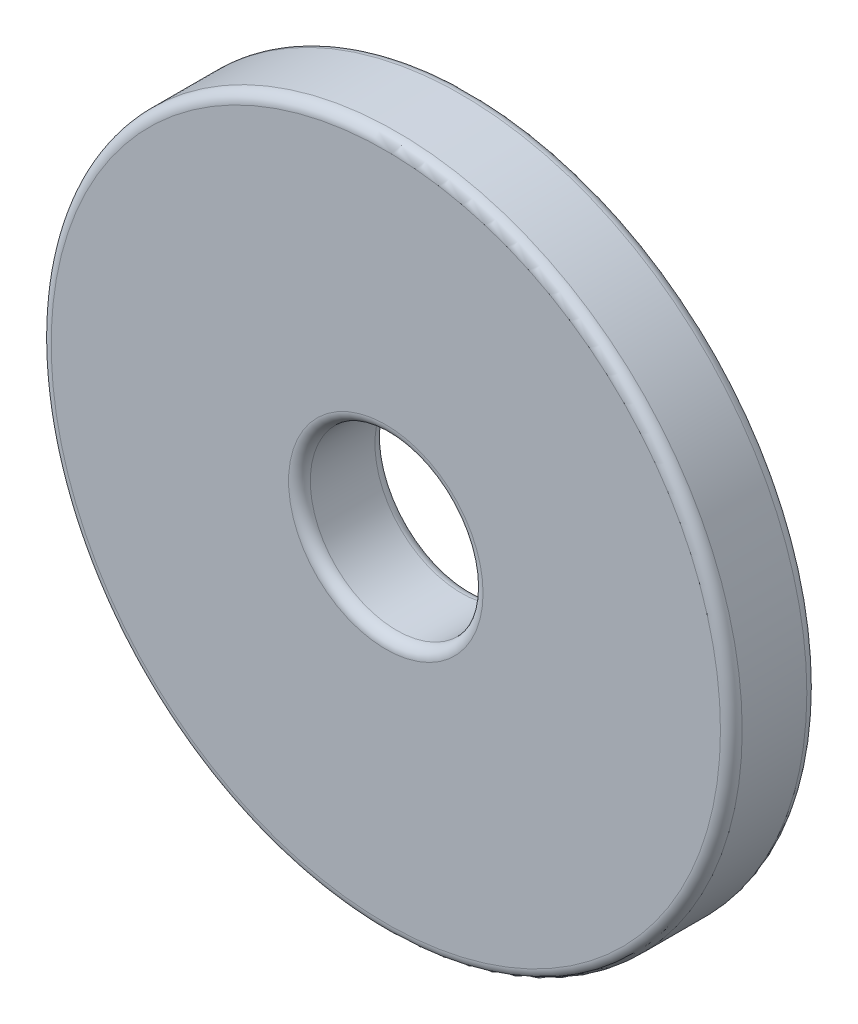
ISO-10303-21;
HEADER;
FILE_DESCRIPTION(('STEP AP214'),'2;1');
FILE_NAME('part.step','',(''),(''),'','','');
FILE_SCHEMA(('AUTOMOTIVE_DESIGN { 1 0 10303 214 1 1 1 1 }'));
ENDSEC;
DATA;
#1=APPLICATION_CONTEXT('core data for automotive mechanical design processes');
#2=APPLICATION_PROTOCOL_DEFINITION('international standard','automotive_design',2000,#1);
#3=PRODUCT_CONTEXT('',#1,'mechanical');
#4=PRODUCT('Part','Part','',(#3));
#5=PRODUCT_RELATED_PRODUCT_CATEGORY('part','',(#4));
#6=PRODUCT_DEFINITION_FORMATION('','',#4);
#7=PRODUCT_DEFINITION_CONTEXT('part definition',#1,'design');
#8=PRODUCT_DEFINITION('design','',#6,#7);
#9=PRODUCT_DEFINITION_SHAPE('','',#8);
#10=(LENGTH_UNIT() NAMED_UNIT(*) SI_UNIT(.MILLI.,.METRE.));
#11=(NAMED_UNIT(*) PLANE_ANGLE_UNIT() SI_UNIT($,.RADIAN.));
#12=(NAMED_UNIT(*) SI_UNIT($,.STERADIAN.) SOLID_ANGLE_UNIT());
#13=UNCERTAINTY_MEASURE_WITH_UNIT(LENGTH_MEASURE(1.E-05),#10,'distance_accuracy_value','');
#14=(GEOMETRIC_REPRESENTATION_CONTEXT(3) GLOBAL_UNCERTAINTY_ASSIGNED_CONTEXT((#13)) GLOBAL_UNIT_ASSIGNED_CONTEXT((#10,
#11,#12)) REPRESENTATION_CONTEXT('',''));
#15=CARTESIAN_POINT('',(0.,0.,0.));
#16=DIRECTION('',(0.,0.,1.));
#17=DIRECTION('',(1.,0.,0.));
#18=AXIS2_PLACEMENT_3D('',#15,#16,#17);
#19=CARTESIAN_POINT('',(68.3982464909084,3.21438697688714,1.5875));
#20=DIRECTION('',(0.,0.,-1.));
#21=DIRECTION('',(-1.,0.,0.));
#22=AXIS2_PLACEMENT_3D('',#19,#20,#21);
#23=CYLINDRICAL_SURFACE('',#22,6.35);
#24=CARTESIAN_POINT('',(68.3982464909084,3.21438697688714,0.2));
#25=DIRECTION('',(0.,0.,1.));
#26=DIRECTION('',(1.,0.,0.));
#27=AXIS2_PLACEMENT_3D('',#24,#25,#26);
#28=CIRCLE('',#27,6.35);
#29=CARTESIAN_POINT('',(74.7482464909084,3.21438697688714,0.2));
#30=VERTEX_POINT('',#29);
#31=EDGE_CURVE('E68',#30,#30,#28,.T.);
#32=ORIENTED_EDGE('',*,*,#31,.T.);
#33=EDGE_LOOP('',(#32));
#34=FACE_BOUND('',#33,.T.);
#35=CARTESIAN_POINT('',(68.3982464909084,3.21438697688714,1.3875));
#36=DIRECTION('',(0.,0.,1.));
#37=DIRECTION('',(1.,0.,0.));
#38=AXIS2_PLACEMENT_3D('',#35,#36,#37);
#39=CIRCLE('',#38,6.35);
#40=CARTESIAN_POINT('',(74.7482464909084,3.21438697688714,1.3875));
#41=VERTEX_POINT('',#40);
#42=EDGE_CURVE('E72',#41,#41,#39,.F.);
#43=ORIENTED_EDGE('',*,*,#42,.T.);
#44=EDGE_LOOP('',(#43));
#45=FACE_BOUND('',#44,.T.);
#46=ADVANCED_FACE('F36',(#34,#45),#23,.T.);
#47=CARTESIAN_POINT('',(68.3982464909084,3.21438697688714,1.5875));
#48=DIRECTION('',(0.,0.,1.));
#49=DIRECTION('',(1.,0.,0.));
#50=AXIS2_PLACEMENT_3D('',#47,#48,#49);
#51=PLANE('',#50);
#52=CARTESIAN_POINT('',(68.3982464909084,3.21438697688714,1.5875));
#53=DIRECTION('',(0.,0.,1.));
#54=DIRECTION('',(1.,0.,0.));
#55=AXIS2_PLACEMENT_3D('',#52,#53,#54);
#56=CIRCLE('',#55,6.15);
#57=CARTESIAN_POINT('',(74.5482464909084,3.21438697688714,1.5875));
#58=VERTEX_POINT('',#57);
#59=EDGE_CURVE('E10',#58,#58,#56,.T.);
#60=ORIENTED_EDGE('',*,*,#59,.T.);
#61=EDGE_LOOP('',(#60));
#62=FACE_BOUND('',#61,.T.);
#63=CARTESIAN_POINT('',(68.3982464909084,3.21438697688714,1.5875));
#64=DIRECTION('',(0.,0.,1.));
#65=DIRECTION('',(1.,0.,0.));
#66=AXIS2_PLACEMENT_3D('',#63,#64,#65);
#67=CIRCLE('',#66,1.7875);
#68=CARTESIAN_POINT('',(70.1857464909084,3.21438697688714,1.5875));
#69=VERTEX_POINT('',#68);
#70=EDGE_CURVE('E44',#69,#69,#67,.F.);
#71=ORIENTED_EDGE('',*,*,#70,.T.);
#72=EDGE_LOOP('',(#71));
#73=FACE_BOUND('',#72,.T.);
#74=ADVANCED_FACE('F91',(#62,#73),#51,.T.);
#75=CARTESIAN_POINT('',(68.3982464909084,3.21438697688714,0.));
#76=DIRECTION('',(0.,0.,1.));
#77=DIRECTION('',(1.,0.,0.));
#78=AXIS2_PLACEMENT_3D('',#75,#76,#77);
#79=PLANE('',#78);
#80=CARTESIAN_POINT('',(68.3982464909084,3.21438697688714,0.));
#81=DIRECTION('',(0.,0.,1.));
#82=DIRECTION('',(1.,0.,0.));
#83=AXIS2_PLACEMENT_3D('',#80,#81,#82);
#84=CIRCLE('',#83,6.15);
#85=CARTESIAN_POINT('',(74.5482464909084,3.21438697688714,0.));
#86=VERTEX_POINT('',#85);
#87=EDGE_CURVE('E60',#86,#86,#84,.F.);
#88=ORIENTED_EDGE('',*,*,#87,.T.);
#89=EDGE_LOOP('',(#88));
#90=FACE_BOUND('',#89,.T.);
#91=CARTESIAN_POINT('',(68.3982464909084,3.21438697688714,0.));
#92=DIRECTION('',(0.,0.,1.));
#93=DIRECTION('',(1.,0.,0.));
#94=AXIS2_PLACEMENT_3D('',#91,#92,#93);
#95=CIRCLE('',#94,1.7875);
#96=CARTESIAN_POINT('',(70.1857464909084,3.21438697688714,0.));
#97=VERTEX_POINT('',#96);
#98=EDGE_CURVE('E64',#97,#97,#95,.T.);
#99=ORIENTED_EDGE('',*,*,#98,.T.);
#100=EDGE_LOOP('',(#99));
#101=FACE_BOUND('',#100,.T.);
#102=ADVANCED_FACE('F97',(#90,#101),#79,.F.);
#103=CARTESIAN_POINT('',(68.3982464909084,3.21438697688714,1.5875));
#104=DIRECTION('',(0.,0.,-1.));
#105=DIRECTION('',(-1.,0.,0.));
#106=AXIS2_PLACEMENT_3D('',#103,#104,#105);
#107=CYLINDRICAL_SURFACE('',#106,1.5875);
#108=CARTESIAN_POINT('',(68.3982464909084,3.21438697688714,0.2));
#109=DIRECTION('',(0.,0.,1.));
#110=DIRECTION('',(1.,0.,0.));
#111=AXIS2_PLACEMENT_3D('',#108,#109,#110);
#112=CIRCLE('',#111,1.5875);
#113=CARTESIAN_POINT('',(69.9857464909084,3.21438697688714,0.2));
#114=VERTEX_POINT('',#113);
#115=EDGE_CURVE('E49',#114,#114,#112,.F.);
#116=ORIENTED_EDGE('',*,*,#115,.T.);
#117=EDGE_LOOP('',(#116));
#118=FACE_BOUND('',#117,.T.);
#119=CARTESIAN_POINT('',(68.3982464909084,3.21438697688714,1.3875));
#120=DIRECTION('',(0.,0.,1.));
#121=DIRECTION('',(1.,0.,0.));
#122=AXIS2_PLACEMENT_3D('',#119,#120,#121);
#123=CIRCLE('',#122,1.5875);
#124=CARTESIAN_POINT('',(69.9857464909084,3.21438697688714,1.3875));
#125=VERTEX_POINT('',#124);
#126=EDGE_CURVE('E54',#125,#125,#123,.T.);
#127=ORIENTED_EDGE('',*,*,#126,.T.);
#128=EDGE_LOOP('',(#127));
#129=FACE_BOUND('',#128,.T.);
#130=ADVANCED_FACE('F102',(#118,#129),#107,.F.);
#131=CARTESIAN_POINT('',(68.3982464909084,3.21438697688714,0.2));
#132=DIRECTION('',(0.,0.,1.));
#133=DIRECTION('',(1.,0.,0.));
#134=AXIS2_PLACEMENT_3D('',#131,#132,#133);
#135=TOROIDAL_SURFACE('',#134,6.15,0.2);
#136=ORIENTED_EDGE('',*,*,#87,.F.);
#137=EDGE_LOOP('',(#136));
#138=FACE_BOUND('',#137,.T.);
#139=ORIENTED_EDGE('',*,*,#31,.F.);
#140=EDGE_LOOP('',(#139));
#141=FACE_BOUND('',#140,.T.);
#142=ADVANCED_FACE('F87',(#138,#141),#135,.T.);
#143=CARTESIAN_POINT('',(68.3982464909084,3.21438697688714,0.2));
#144=DIRECTION('',(0.,0.,1.));
#145=DIRECTION('',(1.,0.,0.));
#146=AXIS2_PLACEMENT_3D('',#143,#144,#145);
#147=TOROIDAL_SURFACE('',#146,1.7875,0.2);
#148=ORIENTED_EDGE('',*,*,#98,.F.);
#149=EDGE_LOOP('',(#148));
#150=FACE_BOUND('',#149,.T.);
#151=ORIENTED_EDGE('',*,*,#115,.F.);
#152=EDGE_LOOP('',(#151));
#153=FACE_BOUND('',#152,.T.);
#154=ADVANCED_FACE('F81',(#150,#153),#147,.T.);
#155=CARTESIAN_POINT('',(68.3982464909084,3.21438697688714,1.3875));
#156=DIRECTION('',(0.,0.,1.));
#157=DIRECTION('',(1.,0.,0.));
#158=AXIS2_PLACEMENT_3D('',#155,#156,#157);
#159=TOROIDAL_SURFACE('',#158,6.15,0.2);
#160=ORIENTED_EDGE('',*,*,#42,.F.);
#161=EDGE_LOOP('',(#160));
#162=FACE_BOUND('',#161,.T.);
#163=ORIENTED_EDGE('',*,*,#59,.F.);
#164=EDGE_LOOP('',(#163));
#165=FACE_BOUND('',#164,.T.);
#166=ADVANCED_FACE('F78',(#162,#165),#159,.T.);
#167=CARTESIAN_POINT('',(68.3982464909084,3.21438697688714,1.3875));
#168=DIRECTION('',(0.,0.,1.));
#169=DIRECTION('',(1.,0.,0.));
#170=AXIS2_PLACEMENT_3D('',#167,#168,#169);
#171=TOROIDAL_SURFACE('',#170,1.7875,0.2);
#172=ORIENTED_EDGE('',*,*,#126,.F.);
#173=EDGE_LOOP('',(#172));
#174=FACE_BOUND('',#173,.T.);
#175=ORIENTED_EDGE('',*,*,#70,.F.);
#176=EDGE_LOOP('',(#175));
#177=FACE_BOUND('',#176,.T.);
#178=ADVANCED_FACE('F38',(#174,#177),#171,.T.);
#179=CLOSED_SHELL('',(#46,#74,#102,#130,#142,#154,#166,#178));
#180=MANIFOLD_SOLID_BREP('B2',#179);
#181=ADVANCED_BREP_SHAPE_REPRESENTATION('',(#18,#180),#14);
#182=SHAPE_DEFINITION_REPRESENTATION(#9,#181);
ENDSEC;
END-ISO-10303-21;
